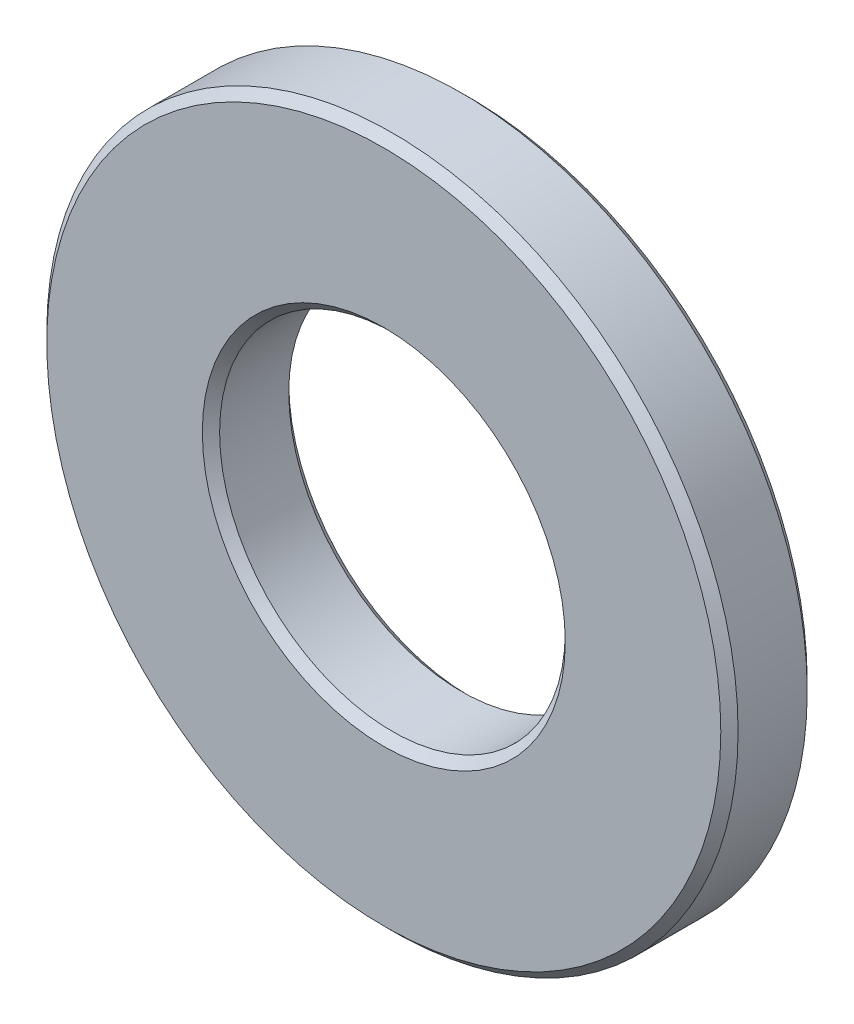
ISO-10303-21;
HEADER;
FILE_DESCRIPTION(('STEP AP214'),'2;1');
FILE_NAME('part.step','',(''),(''),'','','');
FILE_SCHEMA(('AUTOMOTIVE_DESIGN { 1 0 10303 214 1 1 1 1 }'));
ENDSEC;
DATA;
#1=APPLICATION_CONTEXT('core data for automotive mechanical design processes');
#2=APPLICATION_PROTOCOL_DEFINITION('international standard','automotive_design',2000,#1);
#3=PRODUCT_CONTEXT('',#1,'mechanical');
#4=PRODUCT('Part','Part','',(#3));
#5=PRODUCT_RELATED_PRODUCT_CATEGORY('part','',(#4));
#6=PRODUCT_DEFINITION_FORMATION('','',#4);
#7=PRODUCT_DEFINITION_CONTEXT('part definition',#1,'design');
#8=PRODUCT_DEFINITION('design','',#6,#7);
#9=PRODUCT_DEFINITION_SHAPE('','',#8);
#10=(LENGTH_UNIT() NAMED_UNIT(*) SI_UNIT(.MILLI.,.METRE.));
#11=(NAMED_UNIT(*) PLANE_ANGLE_UNIT() SI_UNIT($,.RADIAN.));
#12=(NAMED_UNIT(*) SI_UNIT($,.STERADIAN.) SOLID_ANGLE_UNIT());
#13=UNCERTAINTY_MEASURE_WITH_UNIT(LENGTH_MEASURE(1.E-05),#10,'distance_accuracy_value','');
#14=(GEOMETRIC_REPRESENTATION_CONTEXT(3) GLOBAL_UNCERTAINTY_ASSIGNED_CONTEXT((#13)) GLOBAL_UNIT_ASSIGNED_CONTEXT((#10,
#11,#12)) REPRESENTATION_CONTEXT('',''));
#15=CARTESIAN_POINT('',(0.,0.,0.));
#16=DIRECTION('',(0.,0.,1.));
#17=DIRECTION('',(1.,0.,0.));
#18=AXIS2_PLACEMENT_3D('',#15,#16,#17);
#19=CARTESIAN_POINT('',(0.,0.,0.5));
#20=DIRECTION('',(0.,0.,1.));
#21=DIRECTION('',(1.,0.,0.));
#22=AXIS2_PLACEMENT_3D('',#19,#20,#21);
#23=PLANE('',#22);
#24=CARTESIAN_POINT('',(0.,0.,0.5));
#25=DIRECTION('',(0.,0.,1.));
#26=DIRECTION('',(1.,0.,0.));
#27=AXIS2_PLACEMENT_3D('',#24,#25,#26);
#28=CIRCLE('',#27,2.1);
#29=CARTESIAN_POINT('',(2.1,0.,0.5));
#30=VERTEX_POINT('',#29);
#31=EDGE_CURVE('E56',#30,#30,#28,.F.);
#32=ORIENTED_EDGE('',*,*,#31,.T.);
#33=EDGE_LOOP('',(#32));
#34=FACE_BOUND('',#33,.T.);
#35=CARTESIAN_POINT('',(0.,0.,0.5));
#36=DIRECTION('',(0.,0.,1.));
#37=DIRECTION('',(1.,0.,0.));
#38=AXIS2_PLACEMENT_3D('',#35,#36,#37);
#39=CIRCLE('',#38,3.9);
#40=CARTESIAN_POINT('',(3.9,0.,0.5));
#41=VERTEX_POINT('',#40);
#42=EDGE_CURVE('E59',#41,#41,#39,.T.);
#43=ORIENTED_EDGE('',*,*,#42,.T.);
#44=EDGE_LOOP('',(#43));
#45=FACE_BOUND('',#44,.T.);
#46=ADVANCED_FACE('F35',(#34,#45),#23,.T.);
#47=CARTESIAN_POINT('',(0.,0.,-0.5));
#48=DIRECTION('',(0.,0.,1.));
#49=DIRECTION('',(1.,0.,0.));
#50=AXIS2_PLACEMENT_3D('',#47,#48,#49);
#51=PLANE('',#50);
#52=CARTESIAN_POINT('',(0.,0.,-0.5));
#53=DIRECTION('',(0.,0.,1.));
#54=DIRECTION('',(1.,0.,0.));
#55=AXIS2_PLACEMENT_3D('',#52,#53,#54);
#56=CIRCLE('',#55,2.1);
#57=CARTESIAN_POINT('',(2.1,0.,-0.5));
#58=VERTEX_POINT('',#57);
#59=EDGE_CURVE('E47',#58,#58,#56,.T.);
#60=ORIENTED_EDGE('',*,*,#59,.T.);
#61=EDGE_LOOP('',(#60));
#62=FACE_BOUND('',#61,.T.);
#63=CARTESIAN_POINT('',(0.,0.,-0.5));
#64=DIRECTION('',(0.,0.,1.));
#65=DIRECTION('',(1.,0.,0.));
#66=AXIS2_PLACEMENT_3D('',#63,#64,#65);
#67=CIRCLE('',#66,3.9);
#68=CARTESIAN_POINT('',(3.9,0.,-0.5));
#69=VERTEX_POINT('',#68);
#70=EDGE_CURVE('E51',#69,#69,#67,.F.);
#71=ORIENTED_EDGE('',*,*,#70,.T.);
#72=EDGE_LOOP('',(#71));
#73=FACE_BOUND('',#72,.T.);
#74=ADVANCED_FACE('F79',(#62,#73),#51,.F.);
#75=CARTESIAN_POINT('',(0.,0.,0.5));
#76=DIRECTION('',(0.,0.,-1.));
#77=DIRECTION('',(-1.,0.,0.));
#78=AXIS2_PLACEMENT_3D('',#75,#76,#77);
#79=CYLINDRICAL_SURFACE('',#78,4.);
#80=CARTESIAN_POINT('',(0.,0.,-0.400000000000002));
#81=DIRECTION('',(0.,0.,1.));
#82=DIRECTION('',(1.,0.,0.));
#83=AXIS2_PLACEMENT_3D('',#80,#81,#82);
#84=CIRCLE('',#83,4.);
#85=CARTESIAN_POINT('',(4.,0.,-0.400000000000002));
#86=VERTEX_POINT('',#85);
#87=EDGE_CURVE('E10',#86,#86,#84,.T.);
#88=ORIENTED_EDGE('',*,*,#87,.T.);
#89=EDGE_LOOP('',(#88));
#90=FACE_BOUND('',#89,.T.);
#91=CARTESIAN_POINT('',(0.,0.,0.400000000000004));
#92=DIRECTION('',(0.,0.,1.));
#93=DIRECTION('',(1.,0.,0.));
#94=AXIS2_PLACEMENT_3D('',#91,#92,#93);
#95=CIRCLE('',#94,4.);
#96=CARTESIAN_POINT('',(4.,0.,0.400000000000004));
#97=VERTEX_POINT('',#96);
#98=EDGE_CURVE('E43',#97,#97,#95,.F.);
#99=ORIENTED_EDGE('',*,*,#98,.T.);
#100=EDGE_LOOP('',(#99));
#101=FACE_BOUND('',#100,.T.);
#102=ADVANCED_FACE('F82',(#90,#101),#79,.T.);
#103=CARTESIAN_POINT('',(0.,0.,0.5));
#104=DIRECTION('',(0.,0.,-1.));
#105=DIRECTION('',(-1.,0.,0.));
#106=AXIS2_PLACEMENT_3D('',#103,#104,#105);
#107=CYLINDRICAL_SURFACE('',#106,2.);
#108=CARTESIAN_POINT('',(0.,0.,0.400000000000003));
#109=DIRECTION('',(0.,0.,1.));
#110=DIRECTION('',(1.,0.,0.));
#111=AXIS2_PLACEMENT_3D('',#108,#109,#110);
#112=CIRCLE('',#111,2.);
#113=CARTESIAN_POINT('',(2.,0.,0.400000000000003));
#114=VERTEX_POINT('',#113);
#115=EDGE_CURVE('E62',#114,#114,#112,.T.);
#116=ORIENTED_EDGE('',*,*,#115,.T.);
#117=EDGE_LOOP('',(#116));
#118=FACE_BOUND('',#117,.T.);
#119=CARTESIAN_POINT('',(0.,0.,-0.400000000000002));
#120=DIRECTION('',(0.,0.,1.));
#121=DIRECTION('',(1.,0.,0.));
#122=AXIS2_PLACEMENT_3D('',#119,#120,#121);
#123=CIRCLE('',#122,2.);
#124=CARTESIAN_POINT('',(2.,0.,-0.400000000000002));
#125=VERTEX_POINT('',#124);
#126=EDGE_CURVE('E65',#125,#125,#123,.F.);
#127=ORIENTED_EDGE('',*,*,#126,.T.);
#128=EDGE_LOOP('',(#127));
#129=FACE_BOUND('',#128,.T.);
#130=ADVANCED_FACE('F69',(#118,#129),#107,.F.);
#131=CARTESIAN_POINT('',(0.,0.,0.400000000000003));
#132=DIRECTION('',(0.,0.,1.));
#133=DIRECTION('',(1.,0.,0.));
#134=AXIS2_PLACEMENT_3D('',#131,#132,#133);
#135=CONICAL_SURFACE('',#134,2.,0.785398163397453);
#136=CARTESIAN_POINT('',(2.1,0.,0.5));
#137=CARTESIAN_POINT('',(2.09895833333333,0.,0.498958333333333));
#138=CARTESIAN_POINT('',(2.09791666666666,0.,0.497916666666667));
#139=CARTESIAN_POINT('',(2.09583333333333,0.,0.495833333333333));
#140=CARTESIAN_POINT('',(2.09479166666666,0.,0.494791666666667));
#141=CARTESIAN_POINT('',(2.09270833333333,0.,0.492708333333333));
#142=CARTESIAN_POINT('',(2.09166666666666,0.,0.491666666666667));
#143=CARTESIAN_POINT('',(2.08958333333333,0.,0.489583333333334));
#144=CARTESIAN_POINT('',(2.08854166666666,0.,0.488541666666667));
#145=CARTESIAN_POINT('',(2.08645833333333,0.,0.486458333333334));
#146=CARTESIAN_POINT('',(2.08541666666666,0.,0.485416666666667));
#147=CARTESIAN_POINT('',(2.08333333333333,0.,0.483333333333334));
#148=CARTESIAN_POINT('',(2.08229166666666,0.,0.482291666666667));
#149=CARTESIAN_POINT('',(2.08020833333333,0.,0.480208333333334));
#150=CARTESIAN_POINT('',(2.07916666666666,0.,0.479166666666667));
#151=CARTESIAN_POINT('',(2.07708333333333,0.,0.477083333333334));
#152=CARTESIAN_POINT('',(2.07604166666667,0.,0.476041666666667));
#153=CARTESIAN_POINT('',(2.07395833333333,0.,0.473958333333334));
#154=CARTESIAN_POINT('',(2.07291666666666,0.,0.472916666666667));
#155=CARTESIAN_POINT('',(2.07083333333333,0.,0.470833333333334));
#156=CARTESIAN_POINT('',(2.06979166666666,0.,0.469791666666668));
#157=CARTESIAN_POINT('',(2.06770833333333,0.,0.467708333333334));
#158=CARTESIAN_POINT('',(2.06666666666667,0.,0.466666666666668));
#159=CARTESIAN_POINT('',(2.06458333333333,0.,0.464583333333334));
#160=CARTESIAN_POINT('',(2.06354166666666,0.,0.463541666666668));
#161=CARTESIAN_POINT('',(2.06145833333333,0.,0.461458333333335));
#162=CARTESIAN_POINT('',(2.06041666666667,0.,0.460416666666668));
#163=CARTESIAN_POINT('',(2.05833333333333,0.,0.458333333333335));
#164=CARTESIAN_POINT('',(2.05729166666667,0.,0.457291666666668));
#165=CARTESIAN_POINT('',(2.05520833333333,0.,0.455208333333335));
#166=CARTESIAN_POINT('',(2.05416666666667,0.,0.454166666666668));
#167=CARTESIAN_POINT('',(2.05208333333333,0.,0.452083333333335));
#168=CARTESIAN_POINT('',(2.05104166666667,0.,0.451041666666668));
#169=CARTESIAN_POINT('',(2.04895833333333,0.,0.448958333333335));
#170=CARTESIAN_POINT('',(2.04791666666667,0.,0.447916666666668));
#171=CARTESIAN_POINT('',(2.04583333333333,0.,0.445833333333335));
#172=CARTESIAN_POINT('',(2.04479166666667,0.,0.444791666666668));
#173=CARTESIAN_POINT('',(2.04270833333333,0.,0.442708333333335));
#174=CARTESIAN_POINT('',(2.04166666666667,0.,0.441666666666668));
#175=CARTESIAN_POINT('',(2.03958333333333,0.,0.439583333333335));
#176=CARTESIAN_POINT('',(2.03854166666667,0.,0.438541666666669));
#177=CARTESIAN_POINT('',(2.03645833333333,0.,0.436458333333335));
#178=CARTESIAN_POINT('',(2.03541666666667,0.,0.435416666666669));
#179=CARTESIAN_POINT('',(2.03333333333333,0.,0.433333333333335));
#180=CARTESIAN_POINT('',(2.03229166666667,0.,0.432291666666669));
#181=CARTESIAN_POINT('',(2.03020833333333,0.,0.430208333333336));
#182=CARTESIAN_POINT('',(2.02916666666667,0.,0.429166666666669));
#183=CARTESIAN_POINT('',(2.02708333333333,0.,0.427083333333336));
#184=CARTESIAN_POINT('',(2.02604166666667,0.,0.426041666666669));
#185=CARTESIAN_POINT('',(2.02395833333333,0.,0.423958333333336));
#186=CARTESIAN_POINT('',(2.02291666666667,0.,0.422916666666669));
#187=CARTESIAN_POINT('',(2.02083333333333,0.,0.420833333333336));
#188=CARTESIAN_POINT('',(2.01979166666667,0.,0.419791666666669));
#189=CARTESIAN_POINT('',(2.01770833333333,0.,0.417708333333336));
#190=CARTESIAN_POINT('',(2.01666666666667,0.,0.416666666666669));
#191=CARTESIAN_POINT('',(2.01458333333333,0.,0.414583333333336));
#192=CARTESIAN_POINT('',(2.01354166666667,0.,0.413541666666669));
#193=CARTESIAN_POINT('',(2.01145833333333,0.,0.411458333333336));
#194=CARTESIAN_POINT('',(2.01041666666667,0.,0.410416666666669));
#195=CARTESIAN_POINT('',(2.00833333333333,0.,0.408333333333336));
#196=CARTESIAN_POINT('',(2.00729166666667,0.,0.40729166666667));
#197=CARTESIAN_POINT('',(2.00520833333333,0.,0.405208333333336));
#198=CARTESIAN_POINT('',(2.00416666666667,0.,0.40416666666667));
#199=CARTESIAN_POINT('',(2.00208333333333,0.,0.402083333333336));
#200=CARTESIAN_POINT('',(2.00104166666667,0.,0.40104166666667));
#201=CARTESIAN_POINT('',(2.,0.,0.400000000000003));
#202=B_SPLINE_CURVE_WITH_KNOTS('',3,(#136,#137,#138,#139,#140,#141,#142,#143,#144,#145,#146,
#147,#148,#149,#150,#151,#152,#153,#154,#155,#156,#157,#158,#159,#160,#161,#162,#163,#164,#165,
#166,#167,#168,#169,#170,#171,#172,#173,#174,#175,#176,#177,#178,#179,#180,#181,#182,#183,#184,
#185,#186,#187,#188,#189,#190,#191,#192,#193,#194,#195,#196,#197,#198,#199,#200,#201),
.UNSPECIFIED.,.F.,.F.,(4,2,2,2,2,2,2,2,2,2,2,2,2,2,2,2,2,2,2,2,2,2,2,2,2,2,2,2,2,2,2,2,4),(0.,
0.0044194173824159,0.00883883476483148,0.0132582521472474,0.0176776695296633,0.0220970869120789,
0.0265165042944948,0.0309359216769105,0.0353553390593264,0.0397747564417423,0.0441941738241579,
0.0486135912065738,0.0530330085889897,0.0574524259714053,0.0618718433538212,0.0662912607362368,
0.0707106781186528,0.0751300955010687,0.0795495128834843,0.0839689302659002,0.0883883476483161,
0.0928077650307317,0.0972271824131476,0.101646599795563,0.106066017177979,0.110485434560395,
0.114904851942811,0.119324269325227,0.123743686707643,0.128163104090058,0.132582521472474,
0.13700193885489,0.141421356237306),.UNSPECIFIED.);
#203=EDGE_CURVE('BSEAM75',#30,#114,#202,.T.);
#204=ORIENTED_EDGE('',*,*,#31,.F.);
#205=ORIENTED_EDGE('',*,*,#115,.F.);
#206=ORIENTED_EDGE('',*,*,#203,.T.);
#207=ORIENTED_EDGE('',*,*,#203,.F.);
#208=EDGE_LOOP('',(#204,#206,#205,#207));
#209=FACE_BOUND('',#208,.T.);
#210=ADVANCED_FACE('F75',(#209),#135,.F.);
#211=CARTESIAN_POINT('',(0.,0.,-0.5));
#212=DIRECTION('',(0.,0.,-1.));
#213=DIRECTION('',(-1.,0.,0.));
#214=AXIS2_PLACEMENT_3D('',#211,#212,#213);
#215=CONICAL_SURFACE('',#214,2.1,0.785398163397444);
#216=ORIENTED_EDGE('',*,*,#126,.F.);
#217=EDGE_LOOP('',(#216));
#218=FACE_BOUND('',#217,.T.);
#219=ORIENTED_EDGE('',*,*,#59,.F.);
#220=EDGE_LOOP('',(#219));
#221=FACE_BOUND('',#220,.T.);
#222=ADVANCED_FACE('F71',(#218,#221),#215,.F.);
#223=CARTESIAN_POINT('',(0.,0.,-0.400000000000002));
#224=DIRECTION('',(0.,0.,1.));
#225=DIRECTION('',(1.,0.,0.));
#226=AXIS2_PLACEMENT_3D('',#223,#224,#225);
#227=CONICAL_SURFACE('',#226,4.,0.785398163397453);
#228=ORIENTED_EDGE('',*,*,#70,.F.);
#229=EDGE_LOOP('',(#228));
#230=FACE_BOUND('',#229,.T.);
#231=ORIENTED_EDGE('',*,*,#87,.F.);
#232=EDGE_LOOP('',(#231));
#233=FACE_BOUND('',#232,.T.);
#234=ADVANCED_FACE('F74',(#230,#233),#227,.T.);
#235=CARTESIAN_POINT('',(0.,0.,0.5));
#236=DIRECTION('',(0.,0.,-1.));
#237=DIRECTION('',(-1.,0.,0.));
#238=AXIS2_PLACEMENT_3D('',#235,#236,#237);
#239=CONICAL_SURFACE('',#238,3.9,0.785398163397457);
#240=ORIENTED_EDGE('',*,*,#98,.F.);
#241=EDGE_LOOP('',(#240));
#242=FACE_BOUND('',#241,.T.);
#243=ORIENTED_EDGE('',*,*,#42,.F.);
#244=EDGE_LOOP('',(#243));
#245=FACE_BOUND('',#244,.T.);
#246=ADVANCED_FACE('F38',(#242,#245),#239,.T.);
#247=CLOSED_SHELL('',(#46,#74,#102,#130,#210,#222,#234,#246));
#248=MANIFOLD_SOLID_BREP('B2',#247);
#249=ADVANCED_BREP_SHAPE_REPRESENTATION('',(#18,#248),#14);
#250=SHAPE_DEFINITION_REPRESENTATION(#9,#249);
ENDSEC;
END-ISO-10303-21;
